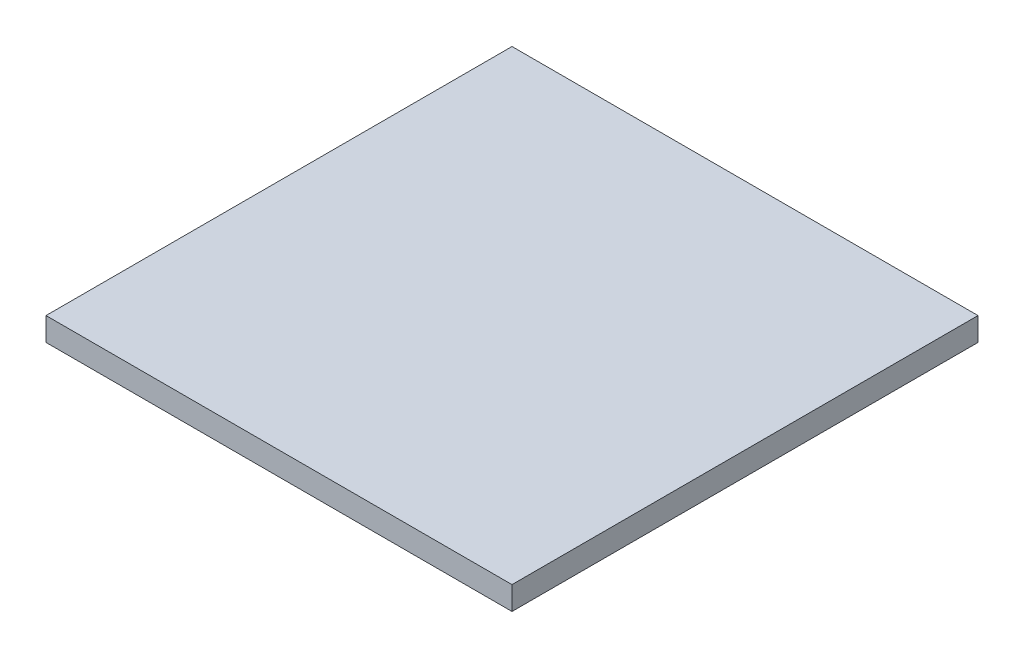
ISO-10303-21;
HEADER;
FILE_DESCRIPTION(('STEP AP214'),'2;1');
FILE_NAME('part.step','',(''),(''),'','','');
FILE_SCHEMA(('AUTOMOTIVE_DESIGN { 1 0 10303 214 1 1 1 1 }'));
ENDSEC;
DATA;
#1=APPLICATION_CONTEXT('core data for automotive mechanical design processes');
#2=APPLICATION_PROTOCOL_DEFINITION('international standard','automotive_design',2000,#1);
#3=PRODUCT_CONTEXT('',#1,'mechanical');
#4=PRODUCT('Part','Part','',(#3));
#5=PRODUCT_RELATED_PRODUCT_CATEGORY('part','',(#4));
#6=PRODUCT_DEFINITION_FORMATION('','',#4);
#7=PRODUCT_DEFINITION_CONTEXT('part definition',#1,'design');
#8=PRODUCT_DEFINITION('design','',#6,#7);
#9=PRODUCT_DEFINITION_SHAPE('','',#8);
#10=(LENGTH_UNIT() NAMED_UNIT(*) SI_UNIT(.MILLI.,.METRE.));
#11=(NAMED_UNIT(*) PLANE_ANGLE_UNIT() SI_UNIT($,.RADIAN.));
#12=(NAMED_UNIT(*) SI_UNIT($,.STERADIAN.) SOLID_ANGLE_UNIT());
#13=UNCERTAINTY_MEASURE_WITH_UNIT(LENGTH_MEASURE(1.E-05),#10,'distance_accuracy_value','');
#14=(GEOMETRIC_REPRESENTATION_CONTEXT(3) GLOBAL_UNCERTAINTY_ASSIGNED_CONTEXT((#13)) GLOBAL_UNIT_ASSIGNED_CONTEXT((#10,
#11,#12)) REPRESENTATION_CONTEXT('',''));
#15=CARTESIAN_POINT('',(0.,0.,0.));
#16=DIRECTION('',(0.,0.,1.));
#17=DIRECTION('',(1.,0.,0.));
#18=AXIS2_PLACEMENT_3D('',#15,#16,#17);
#19=CARTESIAN_POINT('',(0.,0.,0.));
#20=DIRECTION('',(0.,1.,0.));
#21=DIRECTION('',(0.,0.,1.));
#22=AXIS2_PLACEMENT_3D('',#19,#20,#21);
#23=PLANE('',#22);
#24=DIRECTION('',(0.,0.,-1.));
#25=VECTOR('',#24,1.);
#26=CARTESIAN_POINT('',(85.,0.,-5.));
#27=LINE('',#26,#25);
#28=CARTESIAN_POINT('',(85.,0.,85.));
#29=VERTEX_POINT('',#28);
#30=CARTESIAN_POINT('',(85.,0.,-5.));
#31=VERTEX_POINT('',#30);
#32=EDGE_CURVE('E58',#29,#31,#27,.T.);
#33=ORIENTED_EDGE('',*,*,#32,.F.);
#34=DIRECTION('',(1.,0.,0.));
#35=VECTOR('',#34,1.);
#36=CARTESIAN_POINT('',(85.,0.,85.));
#37=LINE('',#36,#35);
#38=CARTESIAN_POINT('',(-4.99999999999996,0.,85.));
#39=VERTEX_POINT('',#38);
#40=EDGE_CURVE('E78',#39,#29,#37,.T.);
#41=ORIENTED_EDGE('',*,*,#40,.F.);
#42=DIRECTION('',(0.,0.,1.));
#43=VECTOR('',#42,1.);
#44=CARTESIAN_POINT('',(-4.99999999999996,0.,-4.99999999999998));
#45=LINE('',#44,#43);
#46=CARTESIAN_POINT('',(-4.99999999999996,0.,-4.99999999999999));
#47=VERTEX_POINT('',#46);
#48=EDGE_CURVE('E84',#47,#39,#45,.T.);
#49=ORIENTED_EDGE('',*,*,#48,.F.);
#50=DIRECTION('',(-1.,0.,0.));
#51=VECTOR('',#50,1.);
#52=CARTESIAN_POINT('',(85.,0.,-5.));
#53=LINE('',#52,#51);
#54=EDGE_CURVE('E89',#31,#47,#53,.T.);
#55=ORIENTED_EDGE('',*,*,#54,.F.);
#56=EDGE_LOOP('',(#33,#41,#49,#55));
#57=FACE_BOUND('',#56,.T.);
#58=ADVANCED_FACE('F34',(#57),#23,.F.);
#59=CARTESIAN_POINT('',(85.,0.,-5.));
#60=DIRECTION('',(1.,0.,0.));
#61=DIRECTION('',(0.,0.,-1.));
#62=AXIS2_PLACEMENT_3D('',#59,#60,#61);
#63=PLANE('',#62);
#64=DIRECTION('',(0.,0.,-1.));
#65=VECTOR('',#64,1.);
#66=CARTESIAN_POINT('',(85.,4.5,-5.));
#67=LINE('',#66,#65);
#68=CARTESIAN_POINT('',(85.,4.5,85.));
#69=VERTEX_POINT('',#68);
#70=CARTESIAN_POINT('',(85.,4.5,-5.));
#71=VERTEX_POINT('',#70);
#72=EDGE_CURVE('E94',#69,#71,#67,.T.);
#73=ORIENTED_EDGE('',*,*,#72,.F.);
#74=DIRECTION('',(0.,1.,0.));
#75=VECTOR('',#74,1.);
#76=CARTESIAN_POINT('',(85.,0.,85.));
#77=LINE('',#76,#75);
#78=EDGE_CURVE('E12',#29,#69,#77,.T.);
#79=ORIENTED_EDGE('',*,*,#78,.F.);
#80=ORIENTED_EDGE('',*,*,#32,.T.);
#81=DIRECTION('',(0.,1.,0.));
#82=VECTOR('',#81,1.);
#83=CARTESIAN_POINT('',(85.,0.,-5.));
#84=LINE('',#83,#82);
#85=EDGE_CURVE('E37',#31,#71,#84,.T.);
#86=ORIENTED_EDGE('',*,*,#85,.T.);
#87=EDGE_LOOP('',(#73,#79,#80,#86));
#88=FACE_BOUND('',#87,.T.);
#89=ADVANCED_FACE('F107',(#88),#63,.T.);
#90=CARTESIAN_POINT('',(85.,0.,85.));
#91=DIRECTION('',(0.,0.,1.));
#92=DIRECTION('',(1.,0.,0.));
#93=AXIS2_PLACEMENT_3D('',#90,#91,#92);
#94=PLANE('',#93);
#95=DIRECTION('',(1.,0.,0.));
#96=VECTOR('',#95,1.);
#97=CARTESIAN_POINT('',(85.,4.5,85.));
#98=LINE('',#97,#96);
#99=CARTESIAN_POINT('',(-4.99999999999996,4.5,85.));
#100=VERTEX_POINT('',#99);
#101=EDGE_CURVE('E80',#100,#69,#98,.T.);
#102=ORIENTED_EDGE('',*,*,#101,.F.);
#103=DIRECTION('',(0.,1.,0.));
#104=VECTOR('',#103,1.);
#105=CARTESIAN_POINT('',(-4.99999999999996,0.,85.));
#106=LINE('',#105,#104);
#107=EDGE_CURVE('E42',#39,#100,#106,.T.);
#108=ORIENTED_EDGE('',*,*,#107,.F.);
#109=ORIENTED_EDGE('',*,*,#40,.T.);
#110=ORIENTED_EDGE('',*,*,#78,.T.);
#111=EDGE_LOOP('',(#102,#108,#109,#110));
#112=FACE_BOUND('',#111,.T.);
#113=ADVANCED_FACE('F76',(#112),#94,.T.);
#114=CARTESIAN_POINT('',(-4.99999999999996,0.,-4.99999999999998));
#115=DIRECTION('',(-1.,0.,0.));
#116=DIRECTION('',(0.,0.,1.));
#117=AXIS2_PLACEMENT_3D('',#114,#115,#116);
#118=PLANE('',#117);
#119=DIRECTION('',(0.,0.,1.));
#120=VECTOR('',#119,1.);
#121=CARTESIAN_POINT('',(-4.99999999999996,4.5,-4.99999999999998));
#122=LINE('',#121,#120);
#123=CARTESIAN_POINT('',(-4.99999999999996,4.5,-4.99999999999998));
#124=VERTEX_POINT('',#123);
#125=EDGE_CURVE('E50',#124,#100,#122,.T.);
#126=ORIENTED_EDGE('',*,*,#125,.F.);
#127=DIRECTION('',(0.,1.,0.));
#128=VECTOR('',#127,1.);
#129=CARTESIAN_POINT('',(-4.99999999999996,0.,-4.99999999999998));
#130=LINE('',#129,#128);
#131=EDGE_CURVE('E81',#47,#124,#130,.T.);
#132=ORIENTED_EDGE('',*,*,#131,.F.);
#133=ORIENTED_EDGE('',*,*,#48,.T.);
#134=ORIENTED_EDGE('',*,*,#107,.T.);
#135=EDGE_LOOP('',(#126,#132,#133,#134));
#136=FACE_BOUND('',#135,.T.);
#137=ADVANCED_FACE('F85',(#136),#118,.T.);
#138=CARTESIAN_POINT('',(85.,0.,-5.));
#139=DIRECTION('',(0.,0.,-1.));
#140=DIRECTION('',(-1.,0.,0.));
#141=AXIS2_PLACEMENT_3D('',#138,#139,#140);
#142=PLANE('',#141);
#143=DIRECTION('',(-1.,0.,0.));
#144=VECTOR('',#143,1.);
#145=CARTESIAN_POINT('',(85.,4.5,-5.));
#146=LINE('',#145,#144);
#147=EDGE_CURVE('E97',#71,#124,#146,.T.);
#148=ORIENTED_EDGE('',*,*,#147,.F.);
#149=ORIENTED_EDGE('',*,*,#85,.F.);
#150=ORIENTED_EDGE('',*,*,#54,.T.);
#151=ORIENTED_EDGE('',*,*,#131,.T.);
#152=EDGE_LOOP('',(#148,#149,#150,#151));
#153=FACE_BOUND('',#152,.T.);
#154=ADVANCED_FACE('F103',(#153),#142,.T.);
#155=CARTESIAN_POINT('',(0.,4.5,0.));
#156=DIRECTION('',(0.,1.,0.));
#157=DIRECTION('',(0.,0.,1.));
#158=AXIS2_PLACEMENT_3D('',#155,#156,#157);
#159=PLANE('',#158);
#160=ORIENTED_EDGE('',*,*,#101,.T.);
#161=ORIENTED_EDGE('',*,*,#72,.T.);
#162=ORIENTED_EDGE('',*,*,#147,.T.);
#163=ORIENTED_EDGE('',*,*,#125,.T.);
#164=EDGE_LOOP('',(#160,#161,#162,#163));
#165=FACE_BOUND('',#164,.T.);
#166=ADVANCED_FACE('F105',(#165),#159,.T.);
#167=CLOSED_SHELL('',(#58,#89,#113,#137,#154,#166));
#168=MANIFOLD_SOLID_BREP('B2',#167);
#169=ADVANCED_BREP_SHAPE_REPRESENTATION('',(#18,#168),#14);
#170=SHAPE_DEFINITION_REPRESENTATION(#9,#169);
ENDSEC;
END-ISO-10303-21;
